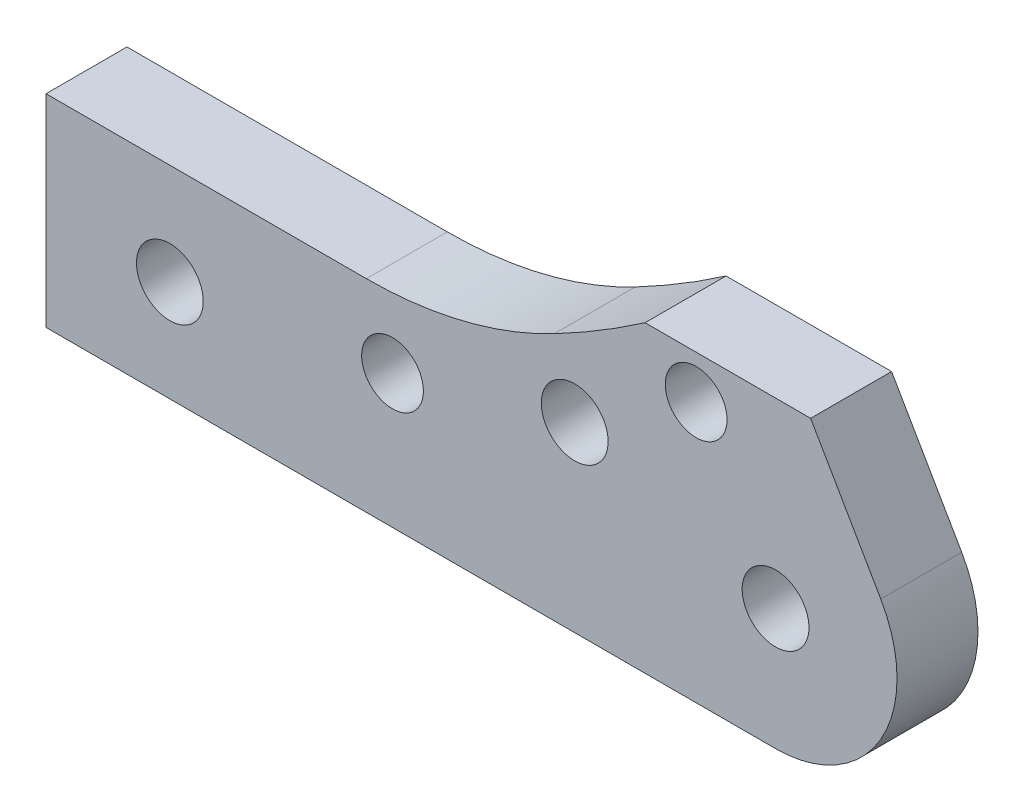
ISO-10303-21;
HEADER;
FILE_DESCRIPTION(('STEP AP214'),'2;1');
FILE_NAME('part.step','',(''),(''),'','','');
FILE_SCHEMA(('AUTOMOTIVE_DESIGN { 1 0 10303 214 1 1 1 1 }'));
ENDSEC;
DATA;
#1=APPLICATION_CONTEXT('core data for automotive mechanical design processes');
#2=APPLICATION_PROTOCOL_DEFINITION('international standard','automotive_design',2000,#1);
#3=PRODUCT_CONTEXT('',#1,'mechanical');
#4=PRODUCT('Part','Part','',(#3));
#5=PRODUCT_RELATED_PRODUCT_CATEGORY('part','',(#4));
#6=PRODUCT_DEFINITION_FORMATION('','',#4);
#7=PRODUCT_DEFINITION_CONTEXT('part definition',#1,'design');
#8=PRODUCT_DEFINITION('design','',#6,#7);
#9=PRODUCT_DEFINITION_SHAPE('','',#8);
#10=(LENGTH_UNIT() NAMED_UNIT(*) SI_UNIT(.MILLI.,.METRE.));
#11=(NAMED_UNIT(*) PLANE_ANGLE_UNIT() SI_UNIT($,.RADIAN.));
#12=(NAMED_UNIT(*) SI_UNIT($,.STERADIAN.) SOLID_ANGLE_UNIT());
#13=UNCERTAINTY_MEASURE_WITH_UNIT(LENGTH_MEASURE(1.E-05),#10,'distance_accuracy_value','');
#14=(GEOMETRIC_REPRESENTATION_CONTEXT(3) GLOBAL_UNCERTAINTY_ASSIGNED_CONTEXT((#13)) GLOBAL_UNIT_ASSIGNED_CONTEXT((#10,
#11,#12)) REPRESENTATION_CONTEXT('',''));
#15=CARTESIAN_POINT('',(0.,0.,0.));
#16=DIRECTION('',(0.,0.,1.));
#17=DIRECTION('',(1.,0.,0.));
#18=AXIS2_PLACEMENT_3D('',#15,#16,#17);
#19=CARTESIAN_POINT('',(28.9932934002841,47.8989174124676,10.));
#20=DIRECTION('',(0.,0.,-1.));
#21=DIRECTION('',(-1.,0.,0.));
#22=AXIS2_PLACEMENT_3D('',#19,#20,#21);
#23=CYLINDRICAL_SURFACE('',#22,20.);
#24=DIRECTION('',(0.,0.,-1.));
#25=VECTOR('',#24,1.);
#26=CARTESIAN_POINT('',(38.2815479510446,30.1865396104818,10.));
#27=LINE('',#26,#25);
#28=CARTESIAN_POINT('',(38.2815479510446,30.1865396104818,0.));
#29=VERTEX_POINT('',#28);
#30=CARTESIAN_POINT('',(38.2815479510446,30.1865396104818,4.));
#31=VERTEX_POINT('',#30);
#32=EDGE_CURVE('E113',#29,#31,#27,.F.);
#33=ORIENTED_EDGE('',*,*,#32,.F.);
#34=CARTESIAN_POINT('',(28.9932934002841,47.8989174124676,0.));
#35=DIRECTION('',(0.,0.,-1.));
#36=DIRECTION('',(-1.,0.,0.));
#37=AXIS2_PLACEMENT_3D('',#34,#35,#36);
#38=CIRCLE('',#37,20.);
#39=CARTESIAN_POINT('',(28.9932934002841,27.8989174124676,0.));
#40=VERTEX_POINT('',#39);
#41=EDGE_CURVE('E49',#29,#40,#38,.T.);
#42=ORIENTED_EDGE('',*,*,#41,.T.);
#43=DIRECTION('',(0.,0.,1.));
#44=VECTOR('',#43,1.);
#45=CARTESIAN_POINT('',(28.9932934002841,27.8989174124676,10.));
#46=LINE('',#45,#44);
#47=CARTESIAN_POINT('',(28.9932934002715,27.8989174124676,4.));
#48=VERTEX_POINT('',#47);
#49=EDGE_CURVE('E174',#48,#40,#46,.F.);
#50=ORIENTED_EDGE('',*,*,#49,.F.);
#51=CARTESIAN_POINT('',(28.9932934002841,47.8989174124676,4.));
#52=DIRECTION('',(0.,0.,-1.));
#53=DIRECTION('',(-1.,0.,0.));
#54=AXIS2_PLACEMENT_3D('',#51,#52,#53);
#55=CIRCLE('',#54,20.);
#56=EDGE_CURVE('E11',#48,#31,#55,.F.);
#57=ORIENTED_EDGE('',*,*,#56,.T.);
#58=EDGE_LOOP('',(#33,#42,#50,#57));
#59=FACE_BOUND('',#58,.T.);
#60=ADVANCED_FACE('F41',(#59),#23,.F.);
#61=CARTESIAN_POINT('',(49.2108673999271,23.8989174124676,4.));
#62=DIRECTION('',(0.,0.,-1.));
#63=DIRECTION('',(-1.,0.,0.));
#64=AXIS2_PLACEMENT_3D('',#61,#62,#63);
#65=PLANE('',#64);
#66=CARTESIAN_POINT('',(30.2874441132091,24.4995975717561,4.));
#67=DIRECTION('',(0.,0.,1.));
#68=DIRECTION('',(1.,0.,0.));
#69=AXIS2_PLACEMENT_3D('',#66,#67,#68);
#70=CIRCLE('',#69,1.525);
#71=CARTESIAN_POINT('',(31.8124441132091,24.4995975717561,4.));
#72=VERTEX_POINT('',#71);
#73=EDGE_CURVE('E178',#72,#72,#70,.T.);
#74=ORIENTED_EDGE('',*,*,#73,.F.);
#75=EDGE_LOOP('',(#74));
#76=FACE_BOUND('',#75,.T.);
#77=CARTESIAN_POINT('',(45.2874441132091,30.7647687764179,4.));
#78=DIRECTION('',(0.,0.,1.));
#79=DIRECTION('',(1.,0.,0.));
#80=AXIS2_PLACEMENT_3D('',#77,#78,#79);
#81=CIRCLE('',#80,1.525);
#82=CARTESIAN_POINT('',(46.8124441132091,30.7647687764179,4.));
#83=VERTEX_POINT('',#82);
#84=EDGE_CURVE('E183',#83,#83,#81,.T.);
#85=ORIENTED_EDGE('',*,*,#84,.F.);
#86=EDGE_LOOP('',(#85));
#87=FACE_BOUND('',#86,.T.);
#88=ORIENTED_EDGE('',*,*,#56,.F.);
#89=DIRECTION('',(-1.,0.,0.));
#90=VECTOR('',#89,1.);
#91=CARTESIAN_POINT('',(49.2108673999271,27.8989174124676,4.));
#92=LINE('',#91,#90);
#93=CARTESIAN_POINT('',(13.1694155155996,27.8989174124676,4.));
#94=VERTEX_POINT('',#93);
#95=EDGE_CURVE('E195',#48,#94,#92,.T.);
#96=ORIENTED_EDGE('',*,*,#95,.T.);
#97=DIRECTION('',(0.,-1.,0.));
#98=VECTOR('',#97,1.);
#99=CARTESIAN_POINT('',(13.1694155155996,17.8989174124676,4.));
#100=LINE('',#99,#98);
#101=CARTESIAN_POINT('',(13.1694155155996,17.8989174124676,4.));
#102=VERTEX_POINT('',#101);
#103=EDGE_CURVE('E141',#94,#102,#100,.T.);
#104=ORIENTED_EDGE('',*,*,#103,.T.);
#105=DIRECTION('',(1.,0.,0.));
#106=VECTOR('',#105,1.);
#107=CARTESIAN_POINT('',(25.1694155155996,17.8989174124676,4.));
#108=LINE('',#107,#106);
#109=CARTESIAN_POINT('',(49.2108673999271,17.8989174124676,4.));
#110=VERTEX_POINT('',#109);
#111=EDGE_CURVE('E143',#102,#110,#108,.T.);
#112=ORIENTED_EDGE('',*,*,#111,.T.);
#113=CARTESIAN_POINT('',(49.2108673999271,23.8989174124676,4.));
#114=DIRECTION('',(0.,0.,1.));
#115=DIRECTION('',(-1.,0.,0.));
#116=AXIS2_PLACEMENT_3D('',#113,#114,#115);
#117=CIRCLE('',#116,6.);
#118=CARTESIAN_POINT('',(54.4070198226337,26.8989174124676,4.));
#119=VERTEX_POINT('',#118);
#120=EDGE_CURVE('E146',#110,#119,#117,.T.);
#121=ORIENTED_EDGE('',*,*,#120,.T.);
#122=DIRECTION('',(-0.500000000000005,0.866025403784436,0.));
#123=VECTOR('',#122,1.);
#124=CARTESIAN_POINT('',(45.1694155155996,42.8989174124676,4.));
#125=LINE('',#124,#123);
#126=CARTESIAN_POINT('',(50.942918207496,32.8989174124676,4.));
#127=VERTEX_POINT('',#126);
#128=EDGE_CURVE('E148',#119,#127,#125,.T.);
#129=ORIENTED_EDGE('',*,*,#128,.T.);
#130=DIRECTION('',(1.,0.,0.));
#131=VECTOR('',#130,1.);
#132=CARTESIAN_POINT('',(13.1694155155996,32.8989174124676,4.));
#133=LINE('',#132,#131);
#134=CARTESIAN_POINT('',(42.7644403010337,32.8989174124676,4.));
#135=VERTEX_POINT('',#134);
#136=EDGE_CURVE('E129',#135,#127,#133,.T.);
#137=ORIENTED_EDGE('',*,*,#136,.F.);
#138=CARTESIAN_POINT('',(18.3739221898137,68.1496883050444,4.));
#139=DIRECTION('',(0.,0.,-1.));
#140=DIRECTION('',(-1.,0.,0.));
#141=AXIS2_PLACEMENT_3D('',#138,#139,#140);
#142=CIRCLE('',#141,42.8662363901322);
#143=EDGE_CURVE('E109',#135,#31,#142,.T.);
#144=ORIENTED_EDGE('',*,*,#143,.T.);
#145=EDGE_LOOP('',(#88,#96,#104,#112,#121,#129,#137,#144));
#146=FACE_BOUND('',#145,.T.);
#147=CARTESIAN_POINT('',(19.2874441132091,22.8989174124676,4.));
#148=DIRECTION('',(0.,0.,1.));
#149=DIRECTION('',(1.,0.,0.));
#150=AXIS2_PLACEMENT_3D('',#147,#148,#149);
#151=CIRCLE('',#150,1.65);
#152=CARTESIAN_POINT('',(20.9374441132091,22.8989174124676,4.));
#153=VERTEX_POINT('',#152);
#154=EDGE_CURVE('E170',#153,#153,#151,.T.);
#155=ORIENTED_EDGE('',*,*,#154,.F.);
#156=EDGE_LOOP('',(#155));
#157=FACE_BOUND('',#156,.T.);
#158=CARTESIAN_POINT('',(39.2874441132091,26.8989174124676,4.));
#159=DIRECTION('',(0.,0.,1.));
#160=DIRECTION('',(1.,0.,0.));
#161=AXIS2_PLACEMENT_3D('',#158,#159,#160);
#162=CIRCLE('',#161,1.65);
#163=CARTESIAN_POINT('',(40.9374441132091,26.8989174124676,4.));
#164=VERTEX_POINT('',#163);
#165=EDGE_CURVE('E197',#164,#164,#162,.T.);
#166=ORIENTED_EDGE('',*,*,#165,.F.);
#167=EDGE_LOOP('',(#166));
#168=FACE_BOUND('',#167,.T.);
#169=CARTESIAN_POINT('',(49.2108673999271,23.8989174124676,4.));
#170=DIRECTION('',(0.,0.,1.));
#171=DIRECTION('',(1.,0.,0.));
#172=AXIS2_PLACEMENT_3D('',#169,#170,#171);
#173=CIRCLE('',#172,1.65);
#174=CARTESIAN_POINT('',(50.8608673999271,23.8989174124676,4.));
#175=VERTEX_POINT('',#174);
#176=EDGE_CURVE('E132',#175,#175,#173,.T.);
#177=ORIENTED_EDGE('',*,*,#176,.F.);
#178=EDGE_LOOP('',(#177));
#179=FACE_BOUND('',#178,.T.);
#180=ADVANCED_FACE('F204',(#76,#87,#146,#157,#168,#179),#65,.F.);
#181=CARTESIAN_POINT('',(49.2108673999271,23.8989174124676,0.));
#182=DIRECTION('',(0.,0.,-1.));
#183=DIRECTION('',(-1.,0.,0.));
#184=AXIS2_PLACEMENT_3D('',#181,#182,#183);
#185=PLANE('',#184);
#186=CARTESIAN_POINT('',(30.2874441132091,24.4995975717561,0.));
#187=DIRECTION('',(0.,0.,-1.));
#188=DIRECTION('',(-1.,0.,0.));
#189=AXIS2_PLACEMENT_3D('',#186,#187,#188);
#190=CIRCLE('',#189,1.525);
#191=CARTESIAN_POINT('',(28.7624441132091,24.4995975717561,0.));
#192=VERTEX_POINT('',#191);
#193=EDGE_CURVE('E44',#192,#192,#190,.T.);
#194=ORIENTED_EDGE('',*,*,#193,.F.);
#195=EDGE_LOOP('',(#194));
#196=FACE_BOUND('',#195,.T.);
#197=CARTESIAN_POINT('',(45.2874441132091,30.7647687764179,0.));
#198=DIRECTION('',(0.,0.,-1.));
#199=DIRECTION('',(-1.,0.,0.));
#200=AXIS2_PLACEMENT_3D('',#197,#198,#199);
#201=CIRCLE('',#200,1.525);
#202=CARTESIAN_POINT('',(43.7624441132091,30.7647687764179,0.));
#203=VERTEX_POINT('',#202);
#204=EDGE_CURVE('E176',#203,#203,#201,.T.);
#205=ORIENTED_EDGE('',*,*,#204,.F.);
#206=EDGE_LOOP('',(#205));
#207=FACE_BOUND('',#206,.T.);
#208=DIRECTION('',(-1.,0.,0.));
#209=VECTOR('',#208,1.);
#210=CARTESIAN_POINT('',(13.1694155155996,27.8989174124676,0.));
#211=LINE('',#210,#209);
#212=CARTESIAN_POINT('',(13.1694155155996,27.8989174124676,0.));
#213=VERTEX_POINT('',#212);
#214=EDGE_CURVE('E124',#40,#213,#211,.T.);
#215=ORIENTED_EDGE('',*,*,#214,.F.);
#216=ORIENTED_EDGE('',*,*,#41,.F.);
#217=CARTESIAN_POINT('',(18.3739221898137,68.1496883050444,0.));
#218=DIRECTION('',(0.,0.,-1.));
#219=DIRECTION('',(-1.,0.,0.));
#220=AXIS2_PLACEMENT_3D('',#217,#218,#219);
#221=CIRCLE('',#220,42.8662363901322);
#222=CARTESIAN_POINT('',(42.7644403010338,32.8989174124676,0.));
#223=VERTEX_POINT('',#222);
#224=EDGE_CURVE('E108',#223,#29,#221,.T.);
#225=ORIENTED_EDGE('',*,*,#224,.F.);
#226=DIRECTION('',(-1.,0.,0.));
#227=VECTOR('',#226,1.);
#228=CARTESIAN_POINT('',(49.2108673999271,32.8989174124676,0.));
#229=LINE('',#228,#227);
#230=CARTESIAN_POINT('',(50.942918207496,32.8989174124676,0.));
#231=VERTEX_POINT('',#230);
#232=EDGE_CURVE('E122',#231,#223,#229,.T.);
#233=ORIENTED_EDGE('',*,*,#232,.F.);
#234=DIRECTION('',(-0.500000000000005,0.866025403784436,0.));
#235=VECTOR('',#234,1.);
#236=CARTESIAN_POINT('',(45.1694155155996,42.8989174124676,0.));
#237=LINE('',#236,#235);
#238=CARTESIAN_POINT('',(54.4070198226337,26.8989174124676,0.));
#239=VERTEX_POINT('',#238);
#240=EDGE_CURVE('E144',#239,#231,#237,.T.);
#241=ORIENTED_EDGE('',*,*,#240,.F.);
#242=CARTESIAN_POINT('',(49.2108673999271,23.8989174124676,0.));
#243=DIRECTION('',(0.,0.,1.));
#244=DIRECTION('',(-1.,0.,0.));
#245=AXIS2_PLACEMENT_3D('',#242,#243,#244);
#246=CIRCLE('',#245,6.);
#247=CARTESIAN_POINT('',(49.2108673999271,17.8989174124676,0.));
#248=VERTEX_POINT('',#247);
#249=EDGE_CURVE('E155',#248,#239,#246,.T.);
#250=ORIENTED_EDGE('',*,*,#249,.F.);
#251=DIRECTION('',(1.,0.,0.));
#252=VECTOR('',#251,1.);
#253=CARTESIAN_POINT('',(49.2108673999271,17.8989174124676,0.));
#254=LINE('',#253,#252);
#255=CARTESIAN_POINT('',(13.1694155155996,17.8989174124676,0.));
#256=VERTEX_POINT('',#255);
#257=EDGE_CURVE('E153',#256,#248,#254,.T.);
#258=ORIENTED_EDGE('',*,*,#257,.F.);
#259=DIRECTION('',(0.,-1.,0.));
#260=VECTOR('',#259,1.);
#261=CARTESIAN_POINT('',(13.1694155155996,17.8989174124676,0.));
#262=LINE('',#261,#260);
#263=EDGE_CURVE('E139',#213,#256,#262,.T.);
#264=ORIENTED_EDGE('',*,*,#263,.F.);
#265=EDGE_LOOP('',(#215,#216,#225,#233,#241,#250,#258,#264));
#266=FACE_BOUND('',#265,.T.);
#267=CARTESIAN_POINT('',(19.2874441132091,22.8989174124676,0.));
#268=DIRECTION('',(0.,0.,-1.));
#269=DIRECTION('',(-1.,0.,0.));
#270=AXIS2_PLACEMENT_3D('',#267,#268,#269);
#271=CIRCLE('',#270,1.65);
#272=CARTESIAN_POINT('',(17.6374441132091,22.8989174124676,0.));
#273=VERTEX_POINT('',#272);
#274=EDGE_CURVE('E134',#273,#273,#271,.T.);
#275=ORIENTED_EDGE('',*,*,#274,.F.);
#276=EDGE_LOOP('',(#275));
#277=FACE_BOUND('',#276,.T.);
#278=CARTESIAN_POINT('',(39.2874441132091,26.8989174124676,0.));
#279=DIRECTION('',(0.,0.,-1.));
#280=DIRECTION('',(-1.,0.,0.));
#281=AXIS2_PLACEMENT_3D('',#278,#279,#280);
#282=CIRCLE('',#281,1.65);
#283=CARTESIAN_POINT('',(37.6374441132091,26.8989174124676,0.));
#284=VERTEX_POINT('',#283);
#285=EDGE_CURVE('E167',#284,#284,#282,.T.);
#286=ORIENTED_EDGE('',*,*,#285,.F.);
#287=EDGE_LOOP('',(#286));
#288=FACE_BOUND('',#287,.T.);
#289=CARTESIAN_POINT('',(49.2108673999271,23.8989174124676,0.));
#290=DIRECTION('',(0.,0.,1.));
#291=DIRECTION('',(1.,0.,0.));
#292=AXIS2_PLACEMENT_3D('',#289,#290,#291);
#293=CIRCLE('',#292,1.65);
#294=CARTESIAN_POINT('',(50.8608673999271,23.8989174124676,0.));
#295=VERTEX_POINT('',#294);
#296=EDGE_CURVE('E128',#295,#295,#293,.T.);
#297=ORIENTED_EDGE('',*,*,#296,.T.);
#298=EDGE_LOOP('',(#297));
#299=FACE_BOUND('',#298,.T.);
#300=ADVANCED_FACE('F119',(#196,#207,#266,#277,#288,#299),#185,.T.);
#301=CARTESIAN_POINT('',(13.1694155155996,17.8989174124676,4.));
#302=DIRECTION('',(1.,0.,0.));
#303=DIRECTION('',(0.,0.,-1.));
#304=AXIS2_PLACEMENT_3D('',#301,#302,#303);
#305=PLANE('',#304);
#306=ORIENTED_EDGE('',*,*,#103,.F.);
#307=DIRECTION('',(0.,0.,-1.));
#308=VECTOR('',#307,1.);
#309=CARTESIAN_POINT('',(13.1694155155996,27.8989174124676,10.));
#310=LINE('',#309,#308);
#311=EDGE_CURVE('E191',#94,#213,#310,.T.);
#312=ORIENTED_EDGE('',*,*,#311,.T.);
#313=ORIENTED_EDGE('',*,*,#263,.T.);
#314=DIRECTION('',(0.,0.,-1.));
#315=VECTOR('',#314,1.);
#316=CARTESIAN_POINT('',(13.1694155155996,17.8989174124676,4.));
#317=LINE('',#316,#315);
#318=EDGE_CURVE('E163',#102,#256,#317,.T.);
#319=ORIENTED_EDGE('',*,*,#318,.F.);
#320=EDGE_LOOP('',(#306,#312,#313,#319));
#321=FACE_BOUND('',#320,.T.);
#322=ADVANCED_FACE('F219',(#321),#305,.F.);
#323=CARTESIAN_POINT('',(49.2108673999271,17.8989174124676,4.));
#324=DIRECTION('',(0.,1.,0.));
#325=DIRECTION('',(0.,0.,1.));
#326=AXIS2_PLACEMENT_3D('',#323,#324,#325);
#327=PLANE('',#326);
#328=ORIENTED_EDGE('',*,*,#257,.T.);
#329=DIRECTION('',(0.,0.,-1.));
#330=VECTOR('',#329,1.);
#331=CARTESIAN_POINT('',(49.2108673999271,17.8989174124676,4.));
#332=LINE('',#331,#330);
#333=EDGE_CURVE('E160',#110,#248,#332,.T.);
#334=ORIENTED_EDGE('',*,*,#333,.F.);
#335=ORIENTED_EDGE('',*,*,#111,.F.);
#336=ORIENTED_EDGE('',*,*,#318,.T.);
#337=EDGE_LOOP('',(#328,#334,#335,#336));
#338=FACE_BOUND('',#337,.T.);
#339=ADVANCED_FACE('F226',(#338),#327,.F.);
#340=CARTESIAN_POINT('',(49.2108673999271,23.8989174124676,4.));
#341=DIRECTION('',(0.,0.,-1.));
#342=DIRECTION('',(-1.,0.,0.));
#343=AXIS2_PLACEMENT_3D('',#340,#341,#342);
#344=CYLINDRICAL_SURFACE('',#343,6.);
#345=ORIENTED_EDGE('',*,*,#249,.T.);
#346=DIRECTION('',(0.,0.,-1.));
#347=VECTOR('',#346,1.);
#348=CARTESIAN_POINT('',(54.4070198226337,26.8989174124676,4.));
#349=LINE('',#348,#347);
#350=EDGE_CURVE('E151',#119,#239,#349,.T.);
#351=ORIENTED_EDGE('',*,*,#350,.F.);
#352=ORIENTED_EDGE('',*,*,#120,.F.);
#353=ORIENTED_EDGE('',*,*,#333,.T.);
#354=EDGE_LOOP('',(#345,#351,#352,#353));
#355=FACE_BOUND('',#354,.T.);
#356=ADVANCED_FACE('F244',(#355),#344,.T.);
#357=CARTESIAN_POINT('',(45.1694155155996,42.8989174124676,4.));
#358=DIRECTION('',(-0.866025403784436,-0.500000000000005,0.));
#359=DIRECTION('',(0.500000000000005,-0.866025403784436,0.));
#360=AXIS2_PLACEMENT_3D('',#357,#358,#359);
#361=PLANE('',#360);
#362=ORIENTED_EDGE('',*,*,#240,.T.);
#363=DIRECTION('',(0.,0.,1.));
#364=VECTOR('',#363,1.);
#365=CARTESIAN_POINT('',(50.942918207496,32.8989174124676,4.));
#366=LINE('',#365,#364);
#367=EDGE_CURVE('E114',#231,#127,#366,.T.);
#368=ORIENTED_EDGE('',*,*,#367,.T.);
#369=ORIENTED_EDGE('',*,*,#128,.F.);
#370=ORIENTED_EDGE('',*,*,#350,.T.);
#371=EDGE_LOOP('',(#362,#368,#369,#370));
#372=FACE_BOUND('',#371,.T.);
#373=ADVANCED_FACE('F214',(#372),#361,.F.);
#374=CARTESIAN_POINT('',(49.2108673999271,23.8989174124676,4.));
#375=DIRECTION('',(0.,0.,-1.));
#376=DIRECTION('',(-1.,0.,0.));
#377=AXIS2_PLACEMENT_3D('',#374,#375,#376);
#378=CYLINDRICAL_SURFACE('',#377,1.65);
#379=ORIENTED_EDGE('',*,*,#176,.T.);
#380=EDGE_LOOP('',(#379));
#381=FACE_BOUND('',#380,.T.);
#382=ORIENTED_EDGE('',*,*,#296,.F.);
#383=EDGE_LOOP('',(#382));
#384=FACE_BOUND('',#383,.T.);
#385=ADVANCED_FACE('F211',(#381,#384),#378,.F.);
#386=CARTESIAN_POINT('',(13.1694155155996,32.8989174124676,-6.));
#387=DIRECTION('',(0.,-1.,0.));
#388=DIRECTION('',(0.,0.,-1.));
#389=AXIS2_PLACEMENT_3D('',#386,#387,#388);
#390=PLANE('',#389);
#391=ORIENTED_EDGE('',*,*,#232,.T.);
#392=DIRECTION('',(0.,0.,-1.));
#393=VECTOR('',#392,1.);
#394=CARTESIAN_POINT('',(42.7644403010337,32.8989174124676,10.));
#395=LINE('',#394,#393);
#396=EDGE_CURVE('E104',#223,#135,#395,.F.);
#397=ORIENTED_EDGE('',*,*,#396,.T.);
#398=ORIENTED_EDGE('',*,*,#136,.T.);
#399=ORIENTED_EDGE('',*,*,#367,.F.);
#400=EDGE_LOOP('',(#391,#397,#398,#399));
#401=FACE_BOUND('',#400,.T.);
#402=ADVANCED_FACE('F126',(#401),#390,.F.);
#403=CARTESIAN_POINT('',(39.2874441132091,26.8989174124676,-6.));
#404=DIRECTION('',(0.,0.,1.));
#405=DIRECTION('',(1.,0.,0.));
#406=AXIS2_PLACEMENT_3D('',#403,#404,#405);
#407=CYLINDRICAL_SURFACE('',#406,1.65);
#408=ORIENTED_EDGE('',*,*,#285,.T.);
#409=EDGE_LOOP('',(#408));
#410=FACE_BOUND('',#409,.T.);
#411=ORIENTED_EDGE('',*,*,#165,.T.);
#412=EDGE_LOOP('',(#411));
#413=FACE_BOUND('',#412,.T.);
#414=ADVANCED_FACE('F202',(#410,#413),#407,.F.);
#415=CARTESIAN_POINT('',(19.2874441132091,22.8989174124676,-6.));
#416=DIRECTION('',(0.,0.,1.));
#417=DIRECTION('',(1.,0.,0.));
#418=AXIS2_PLACEMENT_3D('',#415,#416,#417);
#419=CYLINDRICAL_SURFACE('',#418,1.65);
#420=ORIENTED_EDGE('',*,*,#274,.T.);
#421=EDGE_LOOP('',(#420));
#422=FACE_BOUND('',#421,.T.);
#423=ORIENTED_EDGE('',*,*,#154,.T.);
#424=EDGE_LOOP('',(#423));
#425=FACE_BOUND('',#424,.T.);
#426=ADVANCED_FACE('F255',(#422,#425),#419,.F.);
#427=CARTESIAN_POINT('',(13.1694155155996,27.8989174124676,10.));
#428=DIRECTION('',(0.,-1.,0.));
#429=DIRECTION('',(0.,0.,-1.));
#430=AXIS2_PLACEMENT_3D('',#427,#428,#429);
#431=PLANE('',#430);
#432=ORIENTED_EDGE('',*,*,#95,.F.);
#433=ORIENTED_EDGE('',*,*,#49,.T.);
#434=ORIENTED_EDGE('',*,*,#214,.T.);
#435=ORIENTED_EDGE('',*,*,#311,.F.);
#436=EDGE_LOOP('',(#432,#433,#434,#435));
#437=FACE_BOUND('',#436,.T.);
#438=ADVANCED_FACE('F254',(#437),#431,.F.);
#439=CARTESIAN_POINT('',(18.3739221898137,68.1496883050444,10.));
#440=DIRECTION('',(0.,0.,-1.));
#441=DIRECTION('',(-1.,0.,0.));
#442=AXIS2_PLACEMENT_3D('',#439,#440,#441);
#443=CYLINDRICAL_SURFACE('',#442,42.8662363901322);
#444=ORIENTED_EDGE('',*,*,#224,.T.);
#445=ORIENTED_EDGE('',*,*,#32,.T.);
#446=ORIENTED_EDGE('',*,*,#143,.F.);
#447=ORIENTED_EDGE('',*,*,#396,.F.);
#448=EDGE_LOOP('',(#444,#445,#446,#447));
#449=FACE_BOUND('',#448,.T.);
#450=ADVANCED_FACE('F106',(#449),#443,.F.);
#451=CARTESIAN_POINT('',(45.2874441132091,30.7647687764179,-8.));
#452=DIRECTION('',(0.,0.,1.));
#453=DIRECTION('',(1.,0.,0.));
#454=AXIS2_PLACEMENT_3D('',#451,#452,#453);
#455=CYLINDRICAL_SURFACE('',#454,1.525);
#456=ORIENTED_EDGE('',*,*,#204,.T.);
#457=EDGE_LOOP('',(#456));
#458=FACE_BOUND('',#457,.T.);
#459=ORIENTED_EDGE('',*,*,#84,.T.);
#460=EDGE_LOOP('',(#459));
#461=FACE_BOUND('',#460,.T.);
#462=ADVANCED_FACE('F260',(#458,#461),#455,.F.);
#463=CARTESIAN_POINT('',(30.2874441132091,24.4995975717561,-8.));
#464=DIRECTION('',(0.,0.,1.));
#465=DIRECTION('',(1.,0.,0.));
#466=AXIS2_PLACEMENT_3D('',#463,#464,#465);
#467=CYLINDRICAL_SURFACE('',#466,1.525);
#468=ORIENTED_EDGE('',*,*,#193,.T.);
#469=EDGE_LOOP('',(#468));
#470=FACE_BOUND('',#469,.T.);
#471=ORIENTED_EDGE('',*,*,#73,.T.);
#472=EDGE_LOOP('',(#471));
#473=FACE_BOUND('',#472,.T.);
#474=ADVANCED_FACE('F345',(#470,#473),#467,.F.);
#475=CLOSED_SHELL('',(#60,#180,#300,#322,#339,#356,#373,#385,#402,#414,#426,#438,#450,#462,#474));
#476=MANIFOLD_SOLID_BREP('B2',#475);
#477=ADVANCED_BREP_SHAPE_REPRESENTATION('',(#18,#476),#14);
#478=SHAPE_DEFINITION_REPRESENTATION(#9,#477);
ENDSEC;
END-ISO-10303-21;
